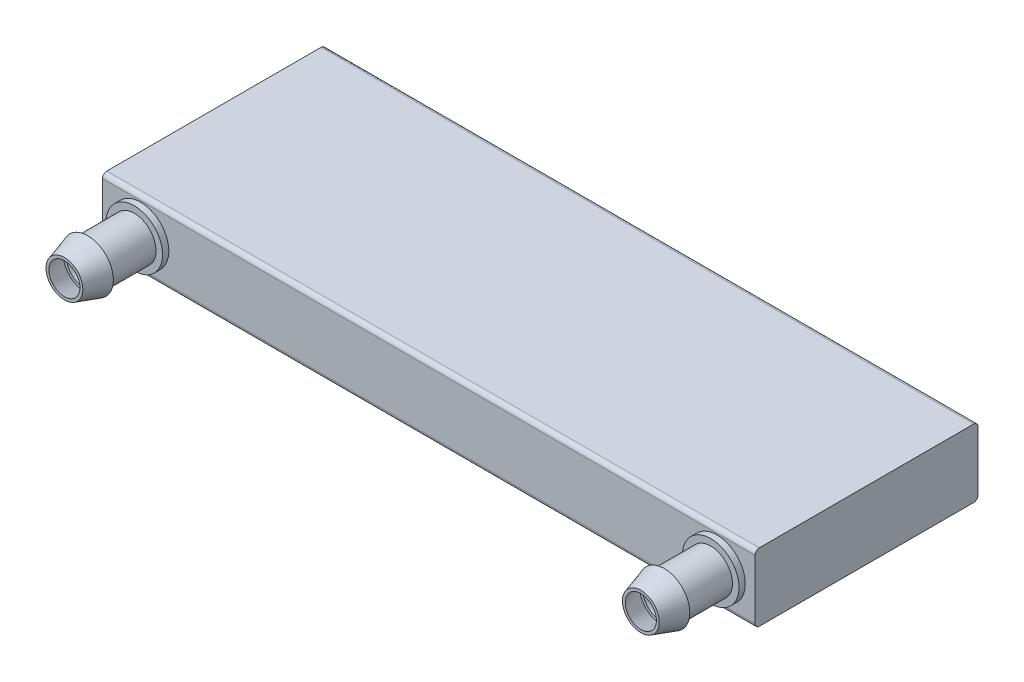
ISO-10303-21;
HEADER;
FILE_DESCRIPTION(('STEP AP214'),'2;1');
FILE_NAME('part.step','',(''),(''),'','','');
FILE_SCHEMA(('AUTOMOTIVE_DESIGN { 1 0 10303 214 1 1 1 1 }'));
ENDSEC;
DATA;
#1=APPLICATION_CONTEXT('core data for automotive mechanical design processes');
#2=APPLICATION_PROTOCOL_DEFINITION('international standard','automotive_design',2000,#1);
#3=PRODUCT_CONTEXT('',#1,'mechanical');
#4=PRODUCT('Part','Part','',(#3));
#5=PRODUCT_RELATED_PRODUCT_CATEGORY('part','',(#4));
#6=PRODUCT_DEFINITION_FORMATION('','',#4);
#7=PRODUCT_DEFINITION_CONTEXT('part definition',#1,'design');
#8=PRODUCT_DEFINITION('design','',#6,#7);
#9=PRODUCT_DEFINITION_SHAPE('','',#8);
#10=(LENGTH_UNIT() NAMED_UNIT(*) SI_UNIT(.MILLI.,.METRE.));
#11=(NAMED_UNIT(*) PLANE_ANGLE_UNIT() SI_UNIT($,.RADIAN.));
#12=(NAMED_UNIT(*) SI_UNIT($,.STERADIAN.) SOLID_ANGLE_UNIT());
#13=UNCERTAINTY_MEASURE_WITH_UNIT(LENGTH_MEASURE(1.E-05),#10,'distance_accuracy_value','');
#14=(GEOMETRIC_REPRESENTATION_CONTEXT(3) GLOBAL_UNCERTAINTY_ASSIGNED_CONTEXT((#13)) GLOBAL_UNIT_ASSIGNED_CONTEXT((#10,
#11,#12)) REPRESENTATION_CONTEXT('',''));
#15=CARTESIAN_POINT('',(0.,0.,0.));
#16=DIRECTION('',(0.,0.,1.));
#17=DIRECTION('',(1.,0.,0.));
#18=AXIS2_PLACEMENT_3D('',#15,#16,#17);
#19=CARTESIAN_POINT('',(-60.,12.5,20.5));
#20=DIRECTION('',(1.,0.,0.));
#21=DIRECTION('',(0.,0.,-1.));
#22=AXIS2_PLACEMENT_3D('',#19,#20,#21);
#23=PLANE('',#22);
#24=DIRECTION('',(0.,0.,1.));
#25=VECTOR('',#24,1.);
#26=CARTESIAN_POINT('',(-60.,0.,20.5));
#27=LINE('',#26,#25);
#28=CARTESIAN_POINT('',(-60.,0.,-19.7));
#29=VERTEX_POINT('',#28);
#30=CARTESIAN_POINT('',(-60.,0.,19.7));
#31=VERTEX_POINT('',#30);
#32=EDGE_CURVE('E280',#29,#31,#27,.T.);
#33=ORIENTED_EDGE('',*,*,#32,.T.);
#34=CARTESIAN_POINT('',(-60.,0.8,19.7));
#35=DIRECTION('',(1.,0.,0.));
#36=DIRECTION('',(0.,0.,-1.));
#37=AXIS2_PLACEMENT_3D('',#34,#35,#36);
#38=CIRCLE('',#37,0.8);
#39=CARTESIAN_POINT('',(-60.,0.8,20.5));
#40=VERTEX_POINT('',#39);
#41=EDGE_CURVE('E325',#31,#40,#38,.F.);
#42=ORIENTED_EDGE('',*,*,#41,.T.);
#43=DIRECTION('',(0.,-1.,0.));
#44=VECTOR('',#43,1.);
#45=CARTESIAN_POINT('',(-60.,12.5,20.5));
#46=LINE('',#45,#44);
#47=CARTESIAN_POINT('',(-60.,11.7,20.5));
#48=VERTEX_POINT('',#47);
#49=EDGE_CURVE('E300',#48,#40,#46,.T.);
#50=ORIENTED_EDGE('',*,*,#49,.F.);
#51=CARTESIAN_POINT('',(-60.,11.7,19.7));
#52=DIRECTION('',(1.,0.,0.));
#53=DIRECTION('',(0.,0.,-1.));
#54=AXIS2_PLACEMENT_3D('',#51,#52,#53);
#55=CIRCLE('',#54,0.8);
#56=CARTESIAN_POINT('',(-60.,12.5,19.7));
#57=VERTEX_POINT('',#56);
#58=EDGE_CURVE('E321',#48,#57,#55,.F.);
#59=ORIENTED_EDGE('',*,*,#58,.T.);
#60=DIRECTION('',(0.,0.,1.));
#61=VECTOR('',#60,1.);
#62=CARTESIAN_POINT('',(-60.,12.5,20.5));
#63=LINE('',#62,#61);
#64=CARTESIAN_POINT('',(-60.,12.5,-19.7));
#65=VERTEX_POINT('',#64);
#66=EDGE_CURVE('E281',#65,#57,#63,.T.);
#67=ORIENTED_EDGE('',*,*,#66,.F.);
#68=CARTESIAN_POINT('',(-60.,11.7,-19.7));
#69=DIRECTION('',(1.,0.,0.));
#70=DIRECTION('',(0.,0.,-1.));
#71=AXIS2_PLACEMENT_3D('',#68,#69,#70);
#72=CIRCLE('',#71,0.8);
#73=CARTESIAN_POINT('',(-60.,11.7,-20.5));
#74=VERTEX_POINT('',#73);
#75=EDGE_CURVE('E55',#65,#74,#72,.F.);
#76=ORIENTED_EDGE('',*,*,#75,.T.);
#77=DIRECTION('',(0.,-1.,0.));
#78=VECTOR('',#77,1.);
#79=CARTESIAN_POINT('',(-60.,12.5,-20.5));
#80=LINE('',#79,#78);
#81=CARTESIAN_POINT('',(-60.,0.8,-20.5));
#82=VERTEX_POINT('',#81);
#83=EDGE_CURVE('E288',#74,#82,#80,.T.);
#84=ORIENTED_EDGE('',*,*,#83,.T.);
#85=CARTESIAN_POINT('',(-60.,0.8,-19.7));
#86=DIRECTION('',(1.,0.,0.));
#87=DIRECTION('',(0.,0.,-1.));
#88=AXIS2_PLACEMENT_3D('',#85,#86,#87);
#89=CIRCLE('',#88,0.8);
#90=EDGE_CURVE('E47',#82,#29,#89,.F.);
#91=ORIENTED_EDGE('',*,*,#90,.T.);
#92=EDGE_LOOP('',(#33,#42,#50,#59,#67,#76,#84,#91));
#93=FACE_BOUND('',#92,.T.);
#94=ADVANCED_FACE('F32',(#93),#23,.F.);
#95=CARTESIAN_POINT('',(60.,12.5,20.5));
#96=DIRECTION('',(0.,0.,-1.));
#97=DIRECTION('',(-1.,0.,0.));
#98=AXIS2_PLACEMENT_3D('',#95,#96,#97);
#99=PLANE('',#98);
#100=CARTESIAN_POINT('',(-53.,6.25,20.5));
#101=DIRECTION('',(0.,0.,-1.));
#102=DIRECTION('',(-1.,0.,0.));
#103=AXIS2_PLACEMENT_3D('',#100,#101,#102);
#104=CIRCLE('',#103,5.2);
#105=CARTESIAN_POINT('',(-58.2,6.25,20.5));
#106=VERTEX_POINT('',#105);
#107=EDGE_CURVE('E257',#106,#106,#104,.T.);
#108=ORIENTED_EDGE('',*,*,#107,.T.);
#109=EDGE_LOOP('',(#108));
#110=FACE_BOUND('',#109,.T.);
#111=CARTESIAN_POINT('',(53.,6.25,20.5));
#112=DIRECTION('',(0.,0.,-1.));
#113=DIRECTION('',(-1.,0.,0.));
#114=AXIS2_PLACEMENT_3D('',#111,#112,#113);
#115=CIRCLE('',#114,5.2);
#116=CARTESIAN_POINT('',(47.8,6.25,20.5));
#117=VERTEX_POINT('',#116);
#118=EDGE_CURVE('E277',#117,#117,#115,.F.);
#119=ORIENTED_EDGE('',*,*,#118,.F.);
#120=EDGE_LOOP('',(#119));
#121=FACE_BOUND('',#120,.T.);
#122=ORIENTED_EDGE('',*,*,#49,.T.);
#123=DIRECTION('',(1.,0.,0.));
#124=VECTOR('',#123,1.);
#125=CARTESIAN_POINT('',(60.,0.8,20.5));
#126=LINE('',#125,#124);
#127=CARTESIAN_POINT('',(60.,0.8,20.5));
#128=VERTEX_POINT('',#127);
#129=EDGE_CURVE('E306',#40,#128,#126,.T.);
#130=ORIENTED_EDGE('',*,*,#129,.T.);
#131=DIRECTION('',(0.,-1.,0.));
#132=VECTOR('',#131,1.);
#133=CARTESIAN_POINT('',(60.,12.5,20.5));
#134=LINE('',#133,#132);
#135=CARTESIAN_POINT('',(60.,11.7,20.5));
#136=VERTEX_POINT('',#135);
#137=EDGE_CURVE('E297',#136,#128,#134,.T.);
#138=ORIENTED_EDGE('',*,*,#137,.F.);
#139=DIRECTION('',(1.,0.,0.));
#140=VECTOR('',#139,1.);
#141=CARTESIAN_POINT('',(-60.,11.7,20.5));
#142=LINE('',#141,#140);
#143=EDGE_CURVE('E276',#136,#48,#142,.F.);
#144=ORIENTED_EDGE('',*,*,#143,.T.);
#145=EDGE_LOOP('',(#122,#130,#138,#144));
#146=FACE_BOUND('',#145,.T.);
#147=ADVANCED_FACE('F349',(#110,#121,#146),#99,.F.);
#148=CARTESIAN_POINT('',(60.,12.5,20.5));
#149=DIRECTION('',(-1.,0.,0.));
#150=DIRECTION('',(0.,0.,1.));
#151=AXIS2_PLACEMENT_3D('',#148,#149,#150);
#152=PLANE('',#151);
#153=ORIENTED_EDGE('',*,*,#137,.T.);
#154=CARTESIAN_POINT('',(60.,0.8,19.7));
#155=DIRECTION('',(-1.,0.,0.));
#156=DIRECTION('',(0.,0.,1.));
#157=AXIS2_PLACEMENT_3D('',#154,#155,#156);
#158=CIRCLE('',#157,0.8);
#159=CARTESIAN_POINT('',(60.,0.,19.7));
#160=VERTEX_POINT('',#159);
#161=EDGE_CURVE('E315',#128,#160,#158,.F.);
#162=ORIENTED_EDGE('',*,*,#161,.T.);
#163=DIRECTION('',(0.,0.,-1.));
#164=VECTOR('',#163,1.);
#165=CARTESIAN_POINT('',(60.,0.,20.5));
#166=LINE('',#165,#164);
#167=CARTESIAN_POINT('',(60.,0.,-19.7));
#168=VERTEX_POINT('',#167);
#169=EDGE_CURVE('E285',#160,#168,#166,.T.);
#170=ORIENTED_EDGE('',*,*,#169,.T.);
#171=CARTESIAN_POINT('',(60.,0.8,-19.7));
#172=DIRECTION('',(-1.,0.,0.));
#173=DIRECTION('',(0.,0.,1.));
#174=AXIS2_PLACEMENT_3D('',#171,#172,#173);
#175=CIRCLE('',#174,0.8);
#176=CARTESIAN_POINT('',(60.,0.8,-20.5));
#177=VERTEX_POINT('',#176);
#178=EDGE_CURVE('E313',#168,#177,#175,.F.);
#179=ORIENTED_EDGE('',*,*,#178,.T.);
#180=DIRECTION('',(0.,-1.,0.));
#181=VECTOR('',#180,1.);
#182=CARTESIAN_POINT('',(60.,12.5,-20.5));
#183=LINE('',#182,#181);
#184=CARTESIAN_POINT('',(60.,11.7,-20.5));
#185=VERTEX_POINT('',#184);
#186=EDGE_CURVE('E294',#185,#177,#183,.T.);
#187=ORIENTED_EDGE('',*,*,#186,.F.);
#188=CARTESIAN_POINT('',(60.,11.7,-19.7));
#189=DIRECTION('',(-1.,0.,0.));
#190=DIRECTION('',(0.,0.,1.));
#191=AXIS2_PLACEMENT_3D('',#188,#189,#190);
#192=CIRCLE('',#191,0.8);
#193=CARTESIAN_POINT('',(60.,12.5,-19.7));
#194=VERTEX_POINT('',#193);
#195=EDGE_CURVE('E311',#185,#194,#192,.F.);
#196=ORIENTED_EDGE('',*,*,#195,.T.);
#197=DIRECTION('',(0.,0.,-1.));
#198=VECTOR('',#197,1.);
#199=CARTESIAN_POINT('',(60.,12.5,20.5));
#200=LINE('',#199,#198);
#201=CARTESIAN_POINT('',(60.,12.5,19.7));
#202=VERTEX_POINT('',#201);
#203=EDGE_CURVE('E284',#202,#194,#200,.T.);
#204=ORIENTED_EDGE('',*,*,#203,.F.);
#205=CARTESIAN_POINT('',(60.,11.7,19.7));
#206=DIRECTION('',(-1.,0.,0.));
#207=DIRECTION('',(0.,0.,1.));
#208=AXIS2_PLACEMENT_3D('',#205,#206,#207);
#209=CIRCLE('',#208,0.8);
#210=EDGE_CURVE('E309',#202,#136,#209,.F.);
#211=ORIENTED_EDGE('',*,*,#210,.T.);
#212=EDGE_LOOP('',(#153,#162,#170,#179,#187,#196,#204,#211));
#213=FACE_BOUND('',#212,.T.);
#214=ADVANCED_FACE('F339',(#213),#152,.F.);
#215=CARTESIAN_POINT('',(60.,12.5,-20.5));
#216=DIRECTION('',(0.,0.,1.));
#217=DIRECTION('',(1.,0.,0.));
#218=AXIS2_PLACEMENT_3D('',#215,#216,#217);
#219=PLANE('',#218);
#220=ORIENTED_EDGE('',*,*,#186,.T.);
#221=DIRECTION('',(-1.,0.,0.));
#222=VECTOR('',#221,1.);
#223=CARTESIAN_POINT('',(60.,0.8,-20.5));
#224=LINE('',#223,#222);
#225=EDGE_CURVE('E329',#177,#82,#224,.T.);
#226=ORIENTED_EDGE('',*,*,#225,.T.);
#227=ORIENTED_EDGE('',*,*,#83,.F.);
#228=DIRECTION('',(-1.,0.,0.));
#229=VECTOR('',#228,1.);
#230=CARTESIAN_POINT('',(60.,11.7,-20.5));
#231=LINE('',#230,#229);
#232=EDGE_CURVE('E327',#74,#185,#231,.F.);
#233=ORIENTED_EDGE('',*,*,#232,.T.);
#234=EDGE_LOOP('',(#220,#226,#227,#233));
#235=FACE_BOUND('',#234,.T.);
#236=ADVANCED_FACE('F362',(#235),#219,.F.);
#237=CARTESIAN_POINT('',(0.,12.5,0.));
#238=DIRECTION('',(0.,1.,0.));
#239=DIRECTION('',(0.,0.,1.));
#240=AXIS2_PLACEMENT_3D('',#237,#238,#239);
#241=PLANE('',#240);
#242=ORIENTED_EDGE('',*,*,#203,.T.);
#243=DIRECTION('',(-1.,0.,0.));
#244=VECTOR('',#243,1.);
#245=CARTESIAN_POINT('',(-60.,12.5,-19.7));
#246=LINE('',#245,#244);
#247=EDGE_CURVE('E11',#194,#65,#246,.T.);
#248=ORIENTED_EDGE('',*,*,#247,.T.);
#249=ORIENTED_EDGE('',*,*,#66,.T.);
#250=DIRECTION('',(1.,0.,0.));
#251=VECTOR('',#250,1.);
#252=CARTESIAN_POINT('',(60.,12.5,19.7));
#253=LINE('',#252,#251);
#254=EDGE_CURVE('E40',#57,#202,#253,.T.);
#255=ORIENTED_EDGE('',*,*,#254,.T.);
#256=EDGE_LOOP('',(#242,#248,#249,#255));
#257=FACE_BOUND('',#256,.T.);
#258=ADVANCED_FACE('F334',(#257),#241,.T.);
#259=CARTESIAN_POINT('',(0.,0.,0.));
#260=DIRECTION('',(0.,1.,0.));
#261=DIRECTION('',(0.,0.,1.));
#262=AXIS2_PLACEMENT_3D('',#259,#260,#261);
#263=PLANE('',#262);
#264=ORIENTED_EDGE('',*,*,#169,.F.);
#265=DIRECTION('',(1.,0.,0.));
#266=VECTOR('',#265,1.);
#267=CARTESIAN_POINT('',(0.,0.,19.7));
#268=LINE('',#267,#266);
#269=EDGE_CURVE('E319',#160,#31,#268,.F.);
#270=ORIENTED_EDGE('',*,*,#269,.T.);
#271=ORIENTED_EDGE('',*,*,#32,.F.);
#272=DIRECTION('',(-1.,0.,0.));
#273=VECTOR('',#272,1.);
#274=CARTESIAN_POINT('',(0.,0.,-19.7));
#275=LINE('',#274,#273);
#276=EDGE_CURVE('E317',#29,#168,#275,.F.);
#277=ORIENTED_EDGE('',*,*,#276,.T.);
#278=EDGE_LOOP('',(#264,#270,#271,#277));
#279=FACE_BOUND('',#278,.T.);
#280=ADVANCED_FACE('F356',(#279),#263,.F.);
#281=CARTESIAN_POINT('',(53.,6.25,21.65));
#282=DIRECTION('',(0.,0.,-1.));
#283=DIRECTION('',(-1.,0.,0.));
#284=AXIS2_PLACEMENT_3D('',#281,#282,#283);
#285=CYLINDRICAL_SURFACE('',#284,5.2);
#286=CARTESIAN_POINT('',(53.,6.25,21.65));
#287=DIRECTION('',(0.,0.,1.));
#288=DIRECTION('',(1.,0.,0.));
#289=AXIS2_PLACEMENT_3D('',#286,#287,#288);
#290=CIRCLE('',#289,5.2);
#291=CARTESIAN_POINT('',(58.2,6.25,21.65));
#292=VERTEX_POINT('',#291);
#293=EDGE_CURVE('E272',#292,#292,#290,.T.);
#294=ORIENTED_EDGE('',*,*,#293,.F.);
#295=EDGE_LOOP('',(#294));
#296=FACE_BOUND('',#295,.T.);
#297=ORIENTED_EDGE('',*,*,#118,.T.);
#298=EDGE_LOOP('',(#297));
#299=FACE_BOUND('',#298,.T.);
#300=ADVANCED_FACE('F510',(#296,#299),#285,.T.);
#301=CARTESIAN_POINT('',(53.,6.25,21.65));
#302=DIRECTION('',(0.,0.,1.));
#303=DIRECTION('',(1.,0.,0.));
#304=AXIS2_PLACEMENT_3D('',#301,#302,#303);
#305=PLANE('',#304);
#306=CARTESIAN_POINT('',(53.,6.25,21.65));
#307=DIRECTION('',(0.,0.,1.));
#308=DIRECTION('',(1.,0.,0.));
#309=AXIS2_PLACEMENT_3D('',#306,#307,#308);
#310=CIRCLE('',#309,4.00000000000001);
#311=CARTESIAN_POINT('',(57.,6.25,21.65));
#312=VERTEX_POINT('',#311);
#313=EDGE_CURVE('E273',#312,#312,#310,.T.);
#314=ORIENTED_EDGE('',*,*,#313,.F.);
#315=EDGE_LOOP('',(#314));
#316=FACE_BOUND('',#315,.T.);
#317=ORIENTED_EDGE('',*,*,#293,.T.);
#318=EDGE_LOOP('',(#317));
#319=FACE_BOUND('',#318,.T.);
#320=ADVANCED_FACE('F506',(#316,#319),#305,.T.);
#321=CARTESIAN_POINT('',(53.,6.25,30.2));
#322=DIRECTION('',(0.,0.,-1.));
#323=DIRECTION('',(-1.,0.,0.));
#324=AXIS2_PLACEMENT_3D('',#321,#322,#323);
#325=CYLINDRICAL_SURFACE('',#324,4.00000000000001);
#326=CARTESIAN_POINT('',(53.,6.25,30.2));
#327=DIRECTION('',(0.,0.,1.));
#328=DIRECTION('',(1.,0.,0.));
#329=AXIS2_PLACEMENT_3D('',#326,#327,#328);
#330=CIRCLE('',#329,4.00000000000001);
#331=CARTESIAN_POINT('',(57.,6.25,30.2));
#332=VERTEX_POINT('',#331);
#333=EDGE_CURVE('E269',#332,#332,#330,.T.);
#334=ORIENTED_EDGE('',*,*,#333,.F.);
#335=EDGE_LOOP('',(#334));
#336=FACE_BOUND('',#335,.T.);
#337=ORIENTED_EDGE('',*,*,#313,.T.);
#338=EDGE_LOOP('',(#337));
#339=FACE_BOUND('',#338,.T.);
#340=ADVANCED_FACE('F502',(#336,#339),#325,.T.);
#341=CARTESIAN_POINT('',(53.,6.25,30.2));
#342=DIRECTION('',(0.,0.,-1.));
#343=DIRECTION('',(1.,0.,0.));
#344=AXIS2_PLACEMENT_3D('',#341,#342,#343);
#345=CONICAL_SURFACE('',#344,4.7,0.296705972839037);
#346=CARTESIAN_POINT('',(53.,6.25,34.5));
#347=DIRECTION('',(0.,0.,1.));
#348=DIRECTION('',(1.,0.,0.));
#349=AXIS2_PLACEMENT_3D('',#346,#347,#348);
#350=CIRCLE('',#349,3.38535806972776);
#351=CARTESIAN_POINT('',(56.3853580697278,6.25,34.5));
#352=VERTEX_POINT('',#351);
#353=EDGE_CURVE('E266',#352,#352,#350,.T.);
#354=ORIENTED_EDGE('',*,*,#353,.F.);
#355=EDGE_LOOP('',(#354));
#356=FACE_BOUND('',#355,.T.);
#357=CARTESIAN_POINT('',(53.,6.25,30.2));
#358=DIRECTION('',(0.,0.,1.));
#359=DIRECTION('',(1.,0.,0.));
#360=AXIS2_PLACEMENT_3D('',#357,#358,#359);
#361=CIRCLE('',#360,4.7);
#362=CARTESIAN_POINT('',(57.7,6.25,30.2));
#363=VERTEX_POINT('',#362);
#364=EDGE_CURVE('E261',#363,#363,#361,.T.);
#365=ORIENTED_EDGE('',*,*,#364,.T.);
#366=EDGE_LOOP('',(#365));
#367=FACE_BOUND('',#366,.T.);
#368=ADVANCED_FACE('F495',(#356,#367),#345,.T.);
#369=CARTESIAN_POINT('',(53.,6.25,34.5));
#370=DIRECTION('',(0.,0.,1.));
#371=DIRECTION('',(1.,0.,0.));
#372=AXIS2_PLACEMENT_3D('',#369,#370,#371);
#373=PLANE('',#372);
#374=CARTESIAN_POINT('',(53.,6.25,34.5));
#375=DIRECTION('',(0.,0.,1.));
#376=DIRECTION('',(1.,0.,0.));
#377=AXIS2_PLACEMENT_3D('',#374,#375,#376);
#378=CIRCLE('',#377,2.86251219148419);
#379=CARTESIAN_POINT('',(55.8625121914842,6.25,34.5));
#380=VERTEX_POINT('',#379);
#381=EDGE_CURVE('E224',#380,#380,#378,.T.);
#382=ORIENTED_EDGE('',*,*,#381,.F.);
#383=EDGE_LOOP('',(#382));
#384=FACE_BOUND('',#383,.T.);
#385=ORIENTED_EDGE('',*,*,#353,.T.);
#386=EDGE_LOOP('',(#385));
#387=FACE_BOUND('',#386,.T.);
#388=ADVANCED_FACE('F492',(#384,#387),#373,.T.);
#389=CARTESIAN_POINT('',(53.,6.25,30.2));
#390=DIRECTION('',(0.,0.,1.));
#391=DIRECTION('',(1.,0.,0.));
#392=AXIS2_PLACEMENT_3D('',#389,#390,#391);
#393=PLANE('',#392);
#394=ORIENTED_EDGE('',*,*,#333,.T.);
#395=EDGE_LOOP('',(#394));
#396=FACE_BOUND('',#395,.T.);
#397=ORIENTED_EDGE('',*,*,#364,.F.);
#398=EDGE_LOOP('',(#397));
#399=FACE_BOUND('',#398,.T.);
#400=ADVANCED_FACE('F490',(#396,#399),#393,.F.);
#401=CARTESIAN_POINT('',(-53.,6.25,21.65));
#402=DIRECTION('',(0.,0.,-1.));
#403=DIRECTION('',(-1.,0.,0.));
#404=AXIS2_PLACEMENT_3D('',#401,#402,#403);
#405=CYLINDRICAL_SURFACE('',#404,5.2);
#406=CARTESIAN_POINT('',(-53.,6.25,21.65));
#407=DIRECTION('',(0.,0.,-1.));
#408=DIRECTION('',(-1.,0.,0.));
#409=AXIS2_PLACEMENT_3D('',#406,#407,#408);
#410=CIRCLE('',#409,5.2);
#411=CARTESIAN_POINT('',(-58.2,6.25,21.65));
#412=VERTEX_POINT('',#411);
#413=EDGE_CURVE('E258',#412,#412,#410,.T.);
#414=ORIENTED_EDGE('',*,*,#413,.T.);
#415=EDGE_LOOP('',(#414));
#416=FACE_BOUND('',#415,.T.);
#417=ORIENTED_EDGE('',*,*,#107,.F.);
#418=EDGE_LOOP('',(#417));
#419=FACE_BOUND('',#418,.T.);
#420=ADVANCED_FACE('F486',(#416,#419),#405,.T.);
#421=CARTESIAN_POINT('',(-53.,6.25,21.65));
#422=DIRECTION('',(0.,0.,1.));
#423=DIRECTION('',(-1.,0.,0.));
#424=AXIS2_PLACEMENT_3D('',#421,#422,#423);
#425=PLANE('',#424);
#426=CARTESIAN_POINT('',(-53.,6.25,21.65));
#427=DIRECTION('',(0.,0.,-1.));
#428=DIRECTION('',(-1.,0.,0.));
#429=AXIS2_PLACEMENT_3D('',#426,#427,#428);
#430=CIRCLE('',#429,4.00000000000001);
#431=CARTESIAN_POINT('',(-57.,6.25,21.65));
#432=VERTEX_POINT('',#431);
#433=EDGE_CURVE('E254',#432,#432,#430,.T.);
#434=ORIENTED_EDGE('',*,*,#433,.T.);
#435=EDGE_LOOP('',(#434));
#436=FACE_BOUND('',#435,.T.);
#437=ORIENTED_EDGE('',*,*,#413,.F.);
#438=EDGE_LOOP('',(#437));
#439=FACE_BOUND('',#438,.T.);
#440=ADVANCED_FACE('F482',(#436,#439),#425,.T.);
#441=CARTESIAN_POINT('',(-53.,6.25,30.2));
#442=DIRECTION('',(0.,0.,-1.));
#443=DIRECTION('',(-1.,0.,0.));
#444=AXIS2_PLACEMENT_3D('',#441,#442,#443);
#445=CYLINDRICAL_SURFACE('',#444,4.00000000000001);
#446=CARTESIAN_POINT('',(-53.,6.25,30.2));
#447=DIRECTION('',(0.,0.,-1.));
#448=DIRECTION('',(-1.,0.,0.));
#449=AXIS2_PLACEMENT_3D('',#446,#447,#448);
#450=CIRCLE('',#449,4.00000000000001);
#451=CARTESIAN_POINT('',(-57.,6.25,30.2));
#452=VERTEX_POINT('',#451);
#453=EDGE_CURVE('E251',#452,#452,#450,.T.);
#454=ORIENTED_EDGE('',*,*,#453,.T.);
#455=EDGE_LOOP('',(#454));
#456=FACE_BOUND('',#455,.T.);
#457=ORIENTED_EDGE('',*,*,#433,.F.);
#458=EDGE_LOOP('',(#457));
#459=FACE_BOUND('',#458,.T.);
#460=ADVANCED_FACE('F478',(#456,#459),#445,.T.);
#461=CARTESIAN_POINT('',(-53.,6.25,30.2));
#462=DIRECTION('',(0.,0.,-1.));
#463=DIRECTION('',(-1.,0.,0.));
#464=AXIS2_PLACEMENT_3D('',#461,#462,#463);
#465=CONICAL_SURFACE('',#464,4.7,0.296705972839037);
#466=CARTESIAN_POINT('',(-53.,6.25,34.5));
#467=DIRECTION('',(0.,0.,1.));
#468=DIRECTION('',(1.,0.,0.));
#469=AXIS2_PLACEMENT_3D('',#466,#467,#468);
#470=CIRCLE('',#469,3.38535806972776);
#471=CARTESIAN_POINT('',(-49.6146419302722,6.25,34.5));
#472=VERTEX_POINT('',#471);
#473=EDGE_CURVE('E248',#472,#472,#470,.F.);
#474=ORIENTED_EDGE('',*,*,#473,.T.);
#475=EDGE_LOOP('',(#474));
#476=FACE_BOUND('',#475,.T.);
#477=CARTESIAN_POINT('',(-53.,6.25,30.2));
#478=DIRECTION('',(0.,0.,-1.));
#479=DIRECTION('',(-1.,0.,0.));
#480=AXIS2_PLACEMENT_3D('',#477,#478,#479);
#481=CIRCLE('',#480,4.7);
#482=CARTESIAN_POINT('',(-57.7,6.25,30.2));
#483=VERTEX_POINT('',#482);
#484=EDGE_CURVE('E213',#483,#483,#481,.T.);
#485=ORIENTED_EDGE('',*,*,#484,.F.);
#486=EDGE_LOOP('',(#485));
#487=FACE_BOUND('',#486,.T.);
#488=ADVANCED_FACE('F471',(#476,#487),#465,.T.);
#489=CARTESIAN_POINT('',(-53.,6.25,34.5));
#490=DIRECTION('',(0.,0.,1.));
#491=DIRECTION('',(-1.,0.,0.));
#492=AXIS2_PLACEMENT_3D('',#489,#490,#491);
#493=PLANE('',#492);
#494=CARTESIAN_POINT('',(-53.,6.25,34.5));
#495=DIRECTION('',(0.,0.,1.));
#496=DIRECTION('',(1.,0.,0.));
#497=AXIS2_PLACEMENT_3D('',#494,#495,#496);
#498=CIRCLE('',#497,2.86251219148419);
#499=CARTESIAN_POINT('',(-50.1374878085158,6.25,34.5));
#500=VERTEX_POINT('',#499);
#501=EDGE_CURVE('E238',#500,#500,#498,.F.);
#502=ORIENTED_EDGE('',*,*,#501,.T.);
#503=EDGE_LOOP('',(#502));
#504=FACE_BOUND('',#503,.T.);
#505=ORIENTED_EDGE('',*,*,#473,.F.);
#506=EDGE_LOOP('',(#505));
#507=FACE_BOUND('',#506,.T.);
#508=ADVANCED_FACE('F468',(#504,#507),#493,.T.);
#509=CARTESIAN_POINT('',(-53.,6.25,30.2));
#510=DIRECTION('',(0.,0.,1.));
#511=DIRECTION('',(-1.,0.,0.));
#512=AXIS2_PLACEMENT_3D('',#509,#510,#511);
#513=PLANE('',#512);
#514=ORIENTED_EDGE('',*,*,#453,.F.);
#515=EDGE_LOOP('',(#514));
#516=FACE_BOUND('',#515,.T.);
#517=ORIENTED_EDGE('',*,*,#484,.T.);
#518=EDGE_LOOP('',(#517));
#519=FACE_BOUND('',#518,.T.);
#520=ADVANCED_FACE('F382',(#516,#519),#513,.F.);
#521=CARTESIAN_POINT('',(60.,0.8,19.7));
#522=DIRECTION('',(1.,0.,0.));
#523=DIRECTION('',(0.,0.,-1.));
#524=AXIS2_PLACEMENT_3D('',#521,#522,#523);
#525=CYLINDRICAL_SURFACE('',#524,0.8);
#526=ORIENTED_EDGE('',*,*,#41,.F.);
#527=ORIENTED_EDGE('',*,*,#269,.F.);
#528=ORIENTED_EDGE('',*,*,#161,.F.);
#529=ORIENTED_EDGE('',*,*,#129,.F.);
#530=EDGE_LOOP('',(#526,#527,#528,#529));
#531=FACE_BOUND('',#530,.T.);
#532=ADVANCED_FACE('F359',(#531),#525,.T.);
#533=CARTESIAN_POINT('',(60.,0.8,-19.7));
#534=DIRECTION('',(-1.,0.,0.));
#535=DIRECTION('',(0.,0.,1.));
#536=AXIS2_PLACEMENT_3D('',#533,#534,#535);
#537=CYLINDRICAL_SURFACE('',#536,0.8);
#538=ORIENTED_EDGE('',*,*,#178,.F.);
#539=ORIENTED_EDGE('',*,*,#276,.F.);
#540=ORIENTED_EDGE('',*,*,#90,.F.);
#541=ORIENTED_EDGE('',*,*,#225,.F.);
#542=EDGE_LOOP('',(#538,#539,#540,#541));
#543=FACE_BOUND('',#542,.T.);
#544=ADVANCED_FACE('F360',(#543),#537,.T.);
#545=CARTESIAN_POINT('',(0.,11.7,-19.7));
#546=DIRECTION('',(1.,0.,0.));
#547=DIRECTION('',(0.,0.,-1.));
#548=AXIS2_PLACEMENT_3D('',#545,#546,#547);
#549=CYLINDRICAL_SURFACE('',#548,0.8);
#550=ORIENTED_EDGE('',*,*,#195,.F.);
#551=ORIENTED_EDGE('',*,*,#232,.F.);
#552=ORIENTED_EDGE('',*,*,#75,.F.);
#553=ORIENTED_EDGE('',*,*,#247,.F.);
#554=EDGE_LOOP('',(#550,#551,#552,#553));
#555=FACE_BOUND('',#554,.T.);
#556=ADVANCED_FACE('F345',(#555),#549,.T.);
#557=CARTESIAN_POINT('',(0.,11.7,19.7));
#558=DIRECTION('',(-1.,0.,0.));
#559=DIRECTION('',(0.,0.,1.));
#560=AXIS2_PLACEMENT_3D('',#557,#558,#559);
#561=CYLINDRICAL_SURFACE('',#560,0.8);
#562=ORIENTED_EDGE('',*,*,#58,.F.);
#563=ORIENTED_EDGE('',*,*,#143,.F.);
#564=ORIENTED_EDGE('',*,*,#210,.F.);
#565=ORIENTED_EDGE('',*,*,#254,.F.);
#566=EDGE_LOOP('',(#562,#563,#564,#565));
#567=FACE_BOUND('',#566,.T.);
#568=ADVANCED_FACE('F34',(#567),#561,.T.);
#569=CARTESIAN_POINT('',(-59.5,12.5,20.5));
#570=DIRECTION('',(1.,0.,0.));
#571=DIRECTION('',(0.,0.,-1.));
#572=AXIS2_PLACEMENT_3D('',#569,#570,#571);
#573=PLANE('',#572);
#574=DIRECTION('',(0.,0.,1.));
#575=VECTOR('',#574,1.);
#576=CARTESIAN_POINT('',(-59.5,0.5,20.5));
#577=LINE('',#576,#575);
#578=CARTESIAN_POINT('',(-59.5,0.5,-19.7));
#579=VERTEX_POINT('',#578);
#580=CARTESIAN_POINT('',(-59.5,0.5,19.7));
#581=VERTEX_POINT('',#580);
#582=EDGE_CURVE('E194',#579,#581,#577,.T.);
#583=ORIENTED_EDGE('',*,*,#582,.F.);
#584=CARTESIAN_POINT('',(-59.5,0.8,-19.7));
#585=DIRECTION('',(1.,0.,0.));
#586=DIRECTION('',(0.,0.,-1.));
#587=AXIS2_PLACEMENT_3D('',#584,#585,#586);
#588=CIRCLE('',#587,0.3);
#589=CARTESIAN_POINT('',(-59.5,0.8,-20.));
#590=VERTEX_POINT('',#589);
#591=EDGE_CURVE('E159',#590,#579,#588,.F.);
#592=ORIENTED_EDGE('',*,*,#591,.F.);
#593=DIRECTION('',(0.,-1.,0.));
#594=VECTOR('',#593,1.);
#595=CARTESIAN_POINT('',(-59.5,12.5,-20.));
#596=LINE('',#595,#594);
#597=CARTESIAN_POINT('',(-59.5,11.7,-20.));
#598=VERTEX_POINT('',#597);
#599=EDGE_CURVE('E198',#598,#590,#596,.T.);
#600=ORIENTED_EDGE('',*,*,#599,.F.);
#601=CARTESIAN_POINT('',(-59.5,11.7,-19.7));
#602=DIRECTION('',(1.,0.,0.));
#603=DIRECTION('',(0.,0.,-1.));
#604=AXIS2_PLACEMENT_3D('',#601,#602,#603);
#605=CIRCLE('',#604,0.3);
#606=CARTESIAN_POINT('',(-59.5,12.,-19.7));
#607=VERTEX_POINT('',#606);
#608=EDGE_CURVE('E792',#607,#598,#605,.F.);
#609=ORIENTED_EDGE('',*,*,#608,.F.);
#610=DIRECTION('',(0.,0.,1.));
#611=VECTOR('',#610,1.);
#612=CARTESIAN_POINT('',(-59.5,12.,20.5));
#613=LINE('',#612,#611);
#614=CARTESIAN_POINT('',(-59.5,12.,19.7));
#615=VERTEX_POINT('',#614);
#616=EDGE_CURVE('E193',#607,#615,#613,.T.);
#617=ORIENTED_EDGE('',*,*,#616,.T.);
#618=CARTESIAN_POINT('',(-59.5,11.7,19.7));
#619=DIRECTION('',(1.,0.,0.));
#620=DIRECTION('',(0.,0.,-1.));
#621=AXIS2_PLACEMENT_3D('',#618,#619,#620);
#622=CIRCLE('',#621,0.3);
#623=CARTESIAN_POINT('',(-59.5,11.7,20.));
#624=VERTEX_POINT('',#623);
#625=EDGE_CURVE('E166',#624,#615,#622,.F.);
#626=ORIENTED_EDGE('',*,*,#625,.F.);
#627=DIRECTION('',(0.,-1.,0.));
#628=VECTOR('',#627,1.);
#629=CARTESIAN_POINT('',(-59.5,12.5,20.));
#630=LINE('',#629,#628);
#631=CARTESIAN_POINT('',(-59.5,0.8,20.));
#632=VERTEX_POINT('',#631);
#633=EDGE_CURVE('E163',#624,#632,#630,.T.);
#634=ORIENTED_EDGE('',*,*,#633,.T.);
#635=CARTESIAN_POINT('',(-59.5,0.8,19.7));
#636=DIRECTION('',(1.,0.,0.));
#637=DIRECTION('',(0.,0.,-1.));
#638=AXIS2_PLACEMENT_3D('',#635,#636,#637);
#639=CIRCLE('',#638,0.3);
#640=EDGE_CURVE('E147',#581,#632,#639,.F.);
#641=ORIENTED_EDGE('',*,*,#640,.F.);
#642=EDGE_LOOP('',(#583,#592,#600,#609,#617,#626,#634,#641));
#643=FACE_BOUND('',#642,.T.);
#644=ADVANCED_FACE('F164',(#643),#573,.T.);
#645=CARTESIAN_POINT('',(60.,12.5,20.));
#646=DIRECTION('',(0.,0.,-1.));
#647=DIRECTION('',(-1.,0.,0.));
#648=AXIS2_PLACEMENT_3D('',#645,#646,#647);
#649=PLANE('',#648);
#650=CARTESIAN_POINT('',(-53.,6.25,20.));
#651=DIRECTION('',(0.,0.,-1.));
#652=DIRECTION('',(-1.,0.,0.));
#653=AXIS2_PLACEMENT_3D('',#650,#651,#652);
#654=CIRCLE('',#653,4.7);
#655=CARTESIAN_POINT('',(-57.7,6.25,20.));
#656=VERTEX_POINT('',#655);
#657=EDGE_CURVE('E231',#656,#656,#654,.T.);
#658=ORIENTED_EDGE('',*,*,#657,.F.);
#659=EDGE_LOOP('',(#658));
#660=FACE_BOUND('',#659,.T.);
#661=CARTESIAN_POINT('',(53.,6.25,20.));
#662=DIRECTION('',(0.,0.,-1.));
#663=DIRECTION('',(-1.,0.,0.));
#664=AXIS2_PLACEMENT_3D('',#661,#662,#663);
#665=CIRCLE('',#664,4.7);
#666=CARTESIAN_POINT('',(48.3,6.25,20.));
#667=VERTEX_POINT('',#666);
#668=EDGE_CURVE('E169',#667,#667,#665,.F.);
#669=ORIENTED_EDGE('',*,*,#668,.T.);
#670=EDGE_LOOP('',(#669));
#671=FACE_BOUND('',#670,.T.);
#672=ORIENTED_EDGE('',*,*,#633,.F.);
#673=DIRECTION('',(-1.,0.,0.));
#674=VECTOR('',#673,1.);
#675=CARTESIAN_POINT('',(60.,11.7,20.));
#676=LINE('',#675,#674);
#677=CARTESIAN_POINT('',(59.5,11.7,20.));
#678=VERTEX_POINT('',#677);
#679=EDGE_CURVE('E175',#678,#624,#676,.T.);
#680=ORIENTED_EDGE('',*,*,#679,.F.);
#681=DIRECTION('',(0.,-1.,0.));
#682=VECTOR('',#681,1.);
#683=CARTESIAN_POINT('',(59.5,12.5,20.));
#684=LINE('',#683,#682);
#685=CARTESIAN_POINT('',(59.5,0.8,20.));
#686=VERTEX_POINT('',#685);
#687=EDGE_CURVE('E170',#678,#686,#684,.T.);
#688=ORIENTED_EDGE('',*,*,#687,.T.);
#689=DIRECTION('',(-1.,0.,0.));
#690=VECTOR('',#689,1.);
#691=CARTESIAN_POINT('',(60.,0.8,20.));
#692=LINE('',#691,#690);
#693=EDGE_CURVE('E151',#632,#686,#692,.F.);
#694=ORIENTED_EDGE('',*,*,#693,.F.);
#695=EDGE_LOOP('',(#672,#680,#688,#694));
#696=FACE_BOUND('',#695,.T.);
#697=ADVANCED_FACE('F172',(#660,#671,#696),#649,.T.);
#698=CARTESIAN_POINT('',(59.5,12.5,20.5));
#699=DIRECTION('',(-1.,0.,0.));
#700=DIRECTION('',(0.,0.,1.));
#701=AXIS2_PLACEMENT_3D('',#698,#699,#700);
#702=PLANE('',#701);
#703=ORIENTED_EDGE('',*,*,#687,.F.);
#704=CARTESIAN_POINT('',(59.5,11.7,19.7));
#705=DIRECTION('',(-1.,0.,0.));
#706=DIRECTION('',(0.,0.,1.));
#707=AXIS2_PLACEMENT_3D('',#704,#705,#706);
#708=CIRCLE('',#707,0.3);
#709=CARTESIAN_POINT('',(59.5,12.,19.7));
#710=VERTEX_POINT('',#709);
#711=EDGE_CURVE('E174',#710,#678,#708,.F.);
#712=ORIENTED_EDGE('',*,*,#711,.F.);
#713=DIRECTION('',(0.,0.,-1.));
#714=VECTOR('',#713,1.);
#715=CARTESIAN_POINT('',(59.5,12.,20.5));
#716=LINE('',#715,#714);
#717=CARTESIAN_POINT('',(59.5,12.,-19.7));
#718=VERTEX_POINT('',#717);
#719=EDGE_CURVE('E200',#710,#718,#716,.T.);
#720=ORIENTED_EDGE('',*,*,#719,.T.);
#721=CARTESIAN_POINT('',(59.5,11.7,-19.7));
#722=DIRECTION('',(-1.,0.,0.));
#723=DIRECTION('',(0.,0.,1.));
#724=AXIS2_PLACEMENT_3D('',#721,#722,#723);
#725=CIRCLE('',#724,0.3);
#726=CARTESIAN_POINT('',(59.5,11.7,-20.));
#727=VERTEX_POINT('',#726);
#728=EDGE_CURVE('E177',#727,#718,#725,.F.);
#729=ORIENTED_EDGE('',*,*,#728,.F.);
#730=DIRECTION('',(0.,-1.,0.));
#731=VECTOR('',#730,1.);
#732=CARTESIAN_POINT('',(59.5,12.5,-20.));
#733=LINE('',#732,#731);
#734=CARTESIAN_POINT('',(59.5,0.8,-20.));
#735=VERTEX_POINT('',#734);
#736=EDGE_CURVE('E184',#727,#735,#733,.T.);
#737=ORIENTED_EDGE('',*,*,#736,.T.);
#738=CARTESIAN_POINT('',(59.5,0.8,-19.7));
#739=DIRECTION('',(-1.,0.,0.));
#740=DIRECTION('',(0.,0.,1.));
#741=AXIS2_PLACEMENT_3D('',#738,#739,#740);
#742=CIRCLE('',#741,0.3);
#743=CARTESIAN_POINT('',(59.5,0.5,-19.7));
#744=VERTEX_POINT('',#743);
#745=EDGE_CURVE('E189',#744,#735,#742,.F.);
#746=ORIENTED_EDGE('',*,*,#745,.F.);
#747=DIRECTION('',(0.,0.,-1.));
#748=VECTOR('',#747,1.);
#749=CARTESIAN_POINT('',(59.5,0.5,20.5));
#750=LINE('',#749,#748);
#751=CARTESIAN_POINT('',(59.5,0.5,19.7));
#752=VERTEX_POINT('',#751);
#753=EDGE_CURVE('E190',#752,#744,#750,.T.);
#754=ORIENTED_EDGE('',*,*,#753,.F.);
#755=CARTESIAN_POINT('',(59.5,0.8,19.7));
#756=DIRECTION('',(-1.,0.,0.));
#757=DIRECTION('',(0.,0.,1.));
#758=AXIS2_PLACEMENT_3D('',#755,#756,#757);
#759=CIRCLE('',#758,0.3);
#760=EDGE_CURVE('E186',#686,#752,#759,.F.);
#761=ORIENTED_EDGE('',*,*,#760,.F.);
#762=EDGE_LOOP('',(#703,#712,#720,#729,#737,#746,#754,#761));
#763=FACE_BOUND('',#762,.T.);
#764=ADVANCED_FACE('F395',(#763),#702,.T.);
#765=CARTESIAN_POINT('',(60.,12.5,-20.));
#766=DIRECTION('',(0.,0.,1.));
#767=DIRECTION('',(1.,0.,0.));
#768=AXIS2_PLACEMENT_3D('',#765,#766,#767);
#769=PLANE('',#768);
#770=ORIENTED_EDGE('',*,*,#736,.F.);
#771=DIRECTION('',(1.,0.,0.));
#772=VECTOR('',#771,1.);
#773=CARTESIAN_POINT('',(60.,11.7,-20.));
#774=LINE('',#773,#772);
#775=EDGE_CURVE('E158',#598,#727,#774,.T.);
#776=ORIENTED_EDGE('',*,*,#775,.F.);
#777=ORIENTED_EDGE('',*,*,#599,.T.);
#778=DIRECTION('',(1.,0.,0.));
#779=VECTOR('',#778,1.);
#780=CARTESIAN_POINT('',(60.,0.8,-20.));
#781=LINE('',#780,#779);
#782=EDGE_CURVE('E203',#735,#590,#781,.F.);
#783=ORIENTED_EDGE('',*,*,#782,.F.);
#784=EDGE_LOOP('',(#770,#776,#777,#783));
#785=FACE_BOUND('',#784,.T.);
#786=ADVANCED_FACE('F401',(#785),#769,.T.);
#787=CARTESIAN_POINT('',(0.,12.,0.));
#788=DIRECTION('',(0.,1.,0.));
#789=DIRECTION('',(0.,0.,1.));
#790=AXIS2_PLACEMENT_3D('',#787,#788,#789);
#791=PLANE('',#790);
#792=ORIENTED_EDGE('',*,*,#719,.F.);
#793=DIRECTION('',(1.,0.,0.));
#794=VECTOR('',#793,1.);
#795=CARTESIAN_POINT('',(0.,12.,19.7));
#796=LINE('',#795,#794);
#797=EDGE_CURVE('E206',#615,#710,#796,.T.);
#798=ORIENTED_EDGE('',*,*,#797,.F.);
#799=ORIENTED_EDGE('',*,*,#616,.F.);
#800=DIRECTION('',(1.,0.,0.));
#801=VECTOR('',#800,1.);
#802=CARTESIAN_POINT('',(0.,12.,-19.7));
#803=LINE('',#802,#801);
#804=EDGE_CURVE('E210',#718,#607,#803,.F.);
#805=ORIENTED_EDGE('',*,*,#804,.F.);
#806=EDGE_LOOP('',(#792,#798,#799,#805));
#807=FACE_BOUND('',#806,.T.);
#808=ADVANCED_FACE('F405',(#807),#791,.F.);
#809=CARTESIAN_POINT('',(0.,0.5,0.));
#810=DIRECTION('',(0.,1.,0.));
#811=DIRECTION('',(0.,0.,1.));
#812=AXIS2_PLACEMENT_3D('',#809,#810,#811);
#813=PLANE('',#812);
#814=ORIENTED_EDGE('',*,*,#753,.T.);
#815=DIRECTION('',(1.,0.,0.));
#816=VECTOR('',#815,1.);
#817=CARTESIAN_POINT('',(0.,0.5,-19.7));
#818=LINE('',#817,#816);
#819=EDGE_CURVE('E188',#579,#744,#818,.T.);
#820=ORIENTED_EDGE('',*,*,#819,.F.);
#821=ORIENTED_EDGE('',*,*,#582,.T.);
#822=DIRECTION('',(1.,0.,0.));
#823=VECTOR('',#822,1.);
#824=CARTESIAN_POINT('',(0.,0.5,19.7));
#825=LINE('',#824,#823);
#826=EDGE_CURVE('E154',#752,#581,#825,.F.);
#827=ORIENTED_EDGE('',*,*,#826,.F.);
#828=EDGE_LOOP('',(#814,#820,#821,#827));
#829=FACE_BOUND('',#828,.T.);
#830=ADVANCED_FACE('F409',(#829),#813,.T.);
#831=CARTESIAN_POINT('',(53.,6.25,21.65));
#832=DIRECTION('',(0.,0.,-1.));
#833=DIRECTION('',(-1.,0.,0.));
#834=AXIS2_PLACEMENT_3D('',#831,#832,#833);
#835=CYLINDRICAL_SURFACE('',#834,4.7);
#836=CARTESIAN_POINT('',(53.,6.25,21.15));
#837=DIRECTION('',(0.,0.,1.));
#838=DIRECTION('',(1.,0.,0.));
#839=AXIS2_PLACEMENT_3D('',#836,#837,#838);
#840=CIRCLE('',#839,4.7);
#841=CARTESIAN_POINT('',(57.7,6.25,21.15));
#842=VERTEX_POINT('',#841);
#843=EDGE_CURVE('E216',#842,#842,#840,.T.);
#844=ORIENTED_EDGE('',*,*,#843,.T.);
#845=EDGE_LOOP('',(#844));
#846=FACE_BOUND('',#845,.T.);
#847=ORIENTED_EDGE('',*,*,#668,.F.);
#848=EDGE_LOOP('',(#847));
#849=FACE_BOUND('',#848,.T.);
#850=ADVANCED_FACE('F413',(#846,#849),#835,.F.);
#851=CARTESIAN_POINT('',(53.,6.25,21.15));
#852=DIRECTION('',(0.,0.,1.));
#853=DIRECTION('',(1.,0.,0.));
#854=AXIS2_PLACEMENT_3D('',#851,#852,#853);
#855=PLANE('',#854);
#856=CARTESIAN_POINT('',(53.,6.25,21.15));
#857=DIRECTION('',(0.,0.,1.));
#858=DIRECTION('',(1.,0.,0.));
#859=AXIS2_PLACEMENT_3D('',#856,#857,#858);
#860=CIRCLE('',#859,3.50000000000001);
#861=CARTESIAN_POINT('',(56.5,6.25,21.15));
#862=VERTEX_POINT('',#861);
#863=EDGE_CURVE('E179',#862,#862,#860,.T.);
#864=ORIENTED_EDGE('',*,*,#863,.T.);
#865=EDGE_LOOP('',(#864));
#866=FACE_BOUND('',#865,.T.);
#867=ORIENTED_EDGE('',*,*,#843,.F.);
#868=EDGE_LOOP('',(#867));
#869=FACE_BOUND('',#868,.T.);
#870=ADVANCED_FACE('F417',(#866,#869),#855,.F.);
#871=CARTESIAN_POINT('',(53.,6.25,30.2));
#872=DIRECTION('',(0.,0.,-1.));
#873=DIRECTION('',(-1.,0.,0.));
#874=AXIS2_PLACEMENT_3D('',#871,#872,#873);
#875=CYLINDRICAL_SURFACE('',#874,3.50000000000001);
#876=CARTESIAN_POINT('',(53.,6.25,30.7));
#877=DIRECTION('',(0.,0.,1.));
#878=DIRECTION('',(1.,0.,0.));
#879=AXIS2_PLACEMENT_3D('',#876,#877,#878);
#880=CIRCLE('',#879,3.50000000000001);
#881=CARTESIAN_POINT('',(56.5,6.25,30.7));
#882=VERTEX_POINT('',#881);
#883=EDGE_CURVE('E219',#882,#882,#880,.T.);
#884=ORIENTED_EDGE('',*,*,#883,.T.);
#885=EDGE_LOOP('',(#884));
#886=FACE_BOUND('',#885,.T.);
#887=ORIENTED_EDGE('',*,*,#863,.F.);
#888=EDGE_LOOP('',(#887));
#889=FACE_BOUND('',#888,.T.);
#890=ADVANCED_FACE('F421',(#886,#889),#875,.F.);
#891=CARTESIAN_POINT('',(53.,6.25,30.0538141476386));
#892=DIRECTION('',(0.,0.,-1.));
#893=DIRECTION('',(1.,0.,0.));
#894=AXIS2_PLACEMENT_3D('',#891,#892,#893);
#895=CONICAL_SURFACE('',#894,4.22184762201848,0.296705972839037);
#896=ORIENTED_EDGE('',*,*,#381,.T.);
#897=EDGE_LOOP('',(#896));
#898=FACE_BOUND('',#897,.T.);
#899=CARTESIAN_POINT('',(53.,6.25,30.7));
#900=DIRECTION('',(0.,0.,1.));
#901=DIRECTION('',(1.,0.,0.));
#902=AXIS2_PLACEMENT_3D('',#899,#900,#901);
#903=CIRCLE('',#902,4.0242887810271);
#904=CARTESIAN_POINT('',(57.0242887810271,6.25,30.7));
#905=VERTEX_POINT('',#904);
#906=EDGE_CURVE('E225',#905,#905,#903,.T.);
#907=ORIENTED_EDGE('',*,*,#906,.F.);
#908=EDGE_LOOP('',(#907));
#909=FACE_BOUND('',#908,.T.);
#910=ADVANCED_FACE('F425',(#898,#909),#895,.F.);
#911=CARTESIAN_POINT('',(53.,6.25,30.7));
#912=DIRECTION('',(0.,0.,1.));
#913=DIRECTION('',(1.,0.,0.));
#914=AXIS2_PLACEMENT_3D('',#911,#912,#913);
#915=PLANE('',#914);
#916=ORIENTED_EDGE('',*,*,#883,.F.);
#917=EDGE_LOOP('',(#916));
#918=FACE_BOUND('',#917,.T.);
#919=ORIENTED_EDGE('',*,*,#906,.T.);
#920=EDGE_LOOP('',(#919));
#921=FACE_BOUND('',#920,.T.);
#922=ADVANCED_FACE('F429',(#918,#921),#915,.T.);
#923=CARTESIAN_POINT('',(-53.,6.25,21.65));
#924=DIRECTION('',(0.,0.,-1.));
#925=DIRECTION('',(-1.,0.,0.));
#926=AXIS2_PLACEMENT_3D('',#923,#924,#925);
#927=CYLINDRICAL_SURFACE('',#926,4.7);
#928=CARTESIAN_POINT('',(-53.,6.25,21.15));
#929=DIRECTION('',(0.,0.,1.));
#930=DIRECTION('',(1.,0.,0.));
#931=AXIS2_PLACEMENT_3D('',#928,#929,#930);
#932=CIRCLE('',#931,4.7);
#933=CARTESIAN_POINT('',(-48.3,6.25,21.15));
#934=VERTEX_POINT('',#933);
#935=EDGE_CURVE('E228',#934,#934,#932,.F.);
#936=ORIENTED_EDGE('',*,*,#935,.F.);
#937=EDGE_LOOP('',(#936));
#938=FACE_BOUND('',#937,.T.);
#939=ORIENTED_EDGE('',*,*,#657,.T.);
#940=EDGE_LOOP('',(#939));
#941=FACE_BOUND('',#940,.T.);
#942=ADVANCED_FACE('F433',(#938,#941),#927,.F.);
#943=CARTESIAN_POINT('',(-53.,6.25,21.15));
#944=DIRECTION('',(0.,0.,1.));
#945=DIRECTION('',(-1.,0.,0.));
#946=AXIS2_PLACEMENT_3D('',#943,#944,#945);
#947=PLANE('',#946);
#948=CARTESIAN_POINT('',(-53.,6.25,21.15));
#949=DIRECTION('',(0.,0.,1.));
#950=DIRECTION('',(1.,0.,0.));
#951=AXIS2_PLACEMENT_3D('',#948,#949,#950);
#952=CIRCLE('',#951,3.50000000000001);
#953=CARTESIAN_POINT('',(-49.5,6.25,21.15));
#954=VERTEX_POINT('',#953);
#955=EDGE_CURVE('E232',#954,#954,#952,.F.);
#956=ORIENTED_EDGE('',*,*,#955,.F.);
#957=EDGE_LOOP('',(#956));
#958=FACE_BOUND('',#957,.T.);
#959=ORIENTED_EDGE('',*,*,#935,.T.);
#960=EDGE_LOOP('',(#959));
#961=FACE_BOUND('',#960,.T.);
#962=ADVANCED_FACE('F437',(#958,#961),#947,.F.);
#963=CARTESIAN_POINT('',(-53.,6.25,30.2));
#964=DIRECTION('',(0.,0.,-1.));
#965=DIRECTION('',(-1.,0.,0.));
#966=AXIS2_PLACEMENT_3D('',#963,#964,#965);
#967=CYLINDRICAL_SURFACE('',#966,3.50000000000001);
#968=CARTESIAN_POINT('',(-53.,6.25,30.7));
#969=DIRECTION('',(0.,0.,1.));
#970=DIRECTION('',(1.,0.,0.));
#971=AXIS2_PLACEMENT_3D('',#968,#969,#970);
#972=CIRCLE('',#971,3.50000000000001);
#973=CARTESIAN_POINT('',(-49.5,6.25,30.7));
#974=VERTEX_POINT('',#973);
#975=EDGE_CURVE('E235',#974,#974,#972,.F.);
#976=ORIENTED_EDGE('',*,*,#975,.F.);
#977=EDGE_LOOP('',(#976));
#978=FACE_BOUND('',#977,.T.);
#979=ORIENTED_EDGE('',*,*,#955,.T.);
#980=EDGE_LOOP('',(#979));
#981=FACE_BOUND('',#980,.T.);
#982=ADVANCED_FACE('F441',(#978,#981),#967,.F.);
#983=CARTESIAN_POINT('',(-53.,6.25,30.0538141476386));
#984=DIRECTION('',(0.,0.,-1.));
#985=DIRECTION('',(-1.,0.,0.));
#986=AXIS2_PLACEMENT_3D('',#983,#984,#985);
#987=CONICAL_SURFACE('',#986,4.22184762201848,0.296705972839037);
#988=ORIENTED_EDGE('',*,*,#501,.F.);
#989=EDGE_LOOP('',(#988));
#990=FACE_BOUND('',#989,.T.);
#991=CARTESIAN_POINT('',(-53.,6.25,30.7));
#992=DIRECTION('',(0.,0.,1.));
#993=DIRECTION('',(1.,0.,0.));
#994=AXIS2_PLACEMENT_3D('',#991,#992,#993);
#995=CIRCLE('',#994,4.0242887810271);
#996=CARTESIAN_POINT('',(-48.9757112189729,6.25,30.7));
#997=VERTEX_POINT('',#996);
#998=EDGE_CURVE('E239',#997,#997,#995,.F.);
#999=ORIENTED_EDGE('',*,*,#998,.T.);
#1000=EDGE_LOOP('',(#999));
#1001=FACE_BOUND('',#1000,.T.);
#1002=ADVANCED_FACE('F445',(#990,#1001),#987,.F.);
#1003=CARTESIAN_POINT('',(-53.,6.25,30.7));
#1004=DIRECTION('',(0.,0.,1.));
#1005=DIRECTION('',(-1.,0.,0.));
#1006=AXIS2_PLACEMENT_3D('',#1003,#1004,#1005);
#1007=PLANE('',#1006);
#1008=ORIENTED_EDGE('',*,*,#975,.T.);
#1009=EDGE_LOOP('',(#1008));
#1010=FACE_BOUND('',#1009,.T.);
#1011=ORIENTED_EDGE('',*,*,#998,.F.);
#1012=EDGE_LOOP('',(#1011));
#1013=FACE_BOUND('',#1012,.T.);
#1014=ADVANCED_FACE('F449',(#1010,#1013),#1007,.T.);
#1015=CARTESIAN_POINT('',(60.,0.8,19.7));
#1016=DIRECTION('',(1.,0.,0.));
#1017=DIRECTION('',(0.,0.,-1.));
#1018=AXIS2_PLACEMENT_3D('',#1015,#1016,#1017);
#1019=CYLINDRICAL_SURFACE('',#1018,0.3);
#1020=ORIENTED_EDGE('',*,*,#640,.T.);
#1021=ORIENTED_EDGE('',*,*,#693,.T.);
#1022=ORIENTED_EDGE('',*,*,#760,.T.);
#1023=ORIENTED_EDGE('',*,*,#826,.T.);
#1024=EDGE_LOOP('',(#1020,#1021,#1022,#1023));
#1025=FACE_BOUND('',#1024,.T.);
#1026=ADVANCED_FACE('F149',(#1025),#1019,.F.);
#1027=CARTESIAN_POINT('',(60.,0.8,-19.7));
#1028=DIRECTION('',(-1.,0.,0.));
#1029=DIRECTION('',(0.,0.,1.));
#1030=AXIS2_PLACEMENT_3D('',#1027,#1028,#1029);
#1031=CYLINDRICAL_SURFACE('',#1030,0.3);
#1032=ORIENTED_EDGE('',*,*,#745,.T.);
#1033=ORIENTED_EDGE('',*,*,#782,.T.);
#1034=ORIENTED_EDGE('',*,*,#591,.T.);
#1035=ORIENTED_EDGE('',*,*,#819,.T.);
#1036=EDGE_LOOP('',(#1032,#1033,#1034,#1035));
#1037=FACE_BOUND('',#1036,.T.);
#1038=ADVANCED_FACE('F456',(#1037),#1031,.F.);
#1039=CARTESIAN_POINT('',(0.,11.7,-19.7));
#1040=DIRECTION('',(1.,0.,0.));
#1041=DIRECTION('',(0.,0.,-1.));
#1042=AXIS2_PLACEMENT_3D('',#1039,#1040,#1041);
#1043=CYLINDRICAL_SURFACE('',#1042,0.3);
#1044=ORIENTED_EDGE('',*,*,#728,.T.);
#1045=ORIENTED_EDGE('',*,*,#804,.T.);
#1046=ORIENTED_EDGE('',*,*,#608,.T.);
#1047=ORIENTED_EDGE('',*,*,#775,.T.);
#1048=EDGE_LOOP('',(#1044,#1045,#1046,#1047));
#1049=FACE_BOUND('',#1048,.T.);
#1050=ADVANCED_FACE('F459',(#1049),#1043,.F.);
#1051=CARTESIAN_POINT('',(0.,11.7,19.7));
#1052=DIRECTION('',(-1.,0.,0.));
#1053=DIRECTION('',(0.,0.,1.));
#1054=AXIS2_PLACEMENT_3D('',#1051,#1052,#1053);
#1055=CYLINDRICAL_SURFACE('',#1054,0.3);
#1056=ORIENTED_EDGE('',*,*,#625,.T.);
#1057=ORIENTED_EDGE('',*,*,#797,.T.);
#1058=ORIENTED_EDGE('',*,*,#711,.T.);
#1059=ORIENTED_EDGE('',*,*,#679,.T.);
#1060=EDGE_LOOP('',(#1056,#1057,#1058,#1059));
#1061=FACE_BOUND('',#1060,.T.);
#1062=ADVANCED_FACE('F463',(#1061),#1055,.F.);
#1063=CLOSED_SHELL('',(#94,#147,#214,#236,#258,#280,#300,#320,#340,#368,#388,#400,#420,#440,
#460,#488,#508,#520,#532,#544,#556,#568,#644,#697,#764,#786,#808,#830,#850,#870,#890,#910,#922,
#942,#962,#982,#1002,#1014,#1026,#1038,#1050,#1062));
#1064=MANIFOLD_SOLID_BREP('B2',#1063);
#1065=ADVANCED_BREP_SHAPE_REPRESENTATION('',(#18,#1064),#14);
#1066=SHAPE_DEFINITION_REPRESENTATION(#9,#1065);
ENDSEC;
END-ISO-10303-21;
